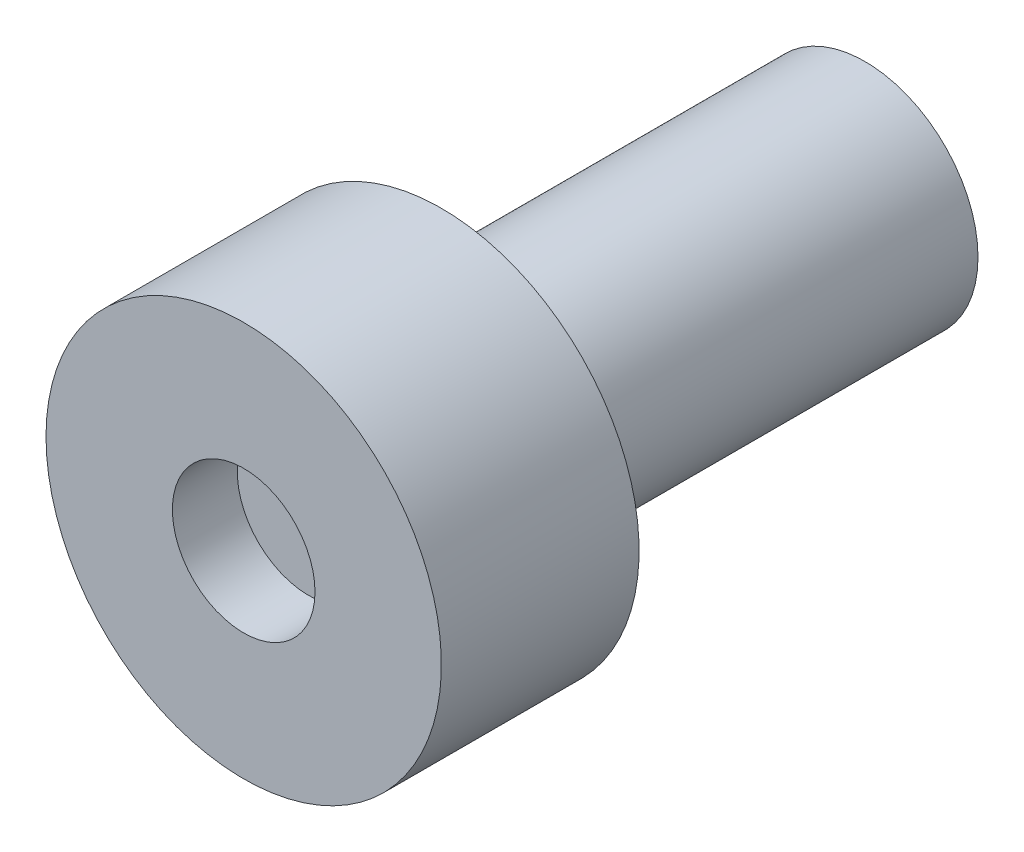
ISO-10303-21;
HEADER;
FILE_DESCRIPTION(('STEP AP214'),'2;1');
FILE_NAME('part.step','',(''),(''),'','','');
FILE_SCHEMA(('AUTOMOTIVE_DESIGN { 1 0 10303 214 1 1 1 1 }'));
ENDSEC;
DATA;
#1=APPLICATION_CONTEXT('core data for automotive mechanical design processes');
#2=APPLICATION_PROTOCOL_DEFINITION('international standard','automotive_design',2000,#1);
#3=PRODUCT_CONTEXT('',#1,'mechanical');
#4=PRODUCT('Part','Part','',(#3));
#5=PRODUCT_RELATED_PRODUCT_CATEGORY('part','',(#4));
#6=PRODUCT_DEFINITION_FORMATION('','',#4);
#7=PRODUCT_DEFINITION_CONTEXT('part definition',#1,'design');
#8=PRODUCT_DEFINITION('design','',#6,#7);
#9=PRODUCT_DEFINITION_SHAPE('','',#8);
#10=(LENGTH_UNIT() NAMED_UNIT(*) SI_UNIT(.MILLI.,.METRE.));
#11=(NAMED_UNIT(*) PLANE_ANGLE_UNIT() SI_UNIT($,.RADIAN.));
#12=(NAMED_UNIT(*) SI_UNIT($,.STERADIAN.) SOLID_ANGLE_UNIT());
#13=UNCERTAINTY_MEASURE_WITH_UNIT(LENGTH_MEASURE(1.E-05),#10,'distance_accuracy_value','');
#14=(GEOMETRIC_REPRESENTATION_CONTEXT(3) GLOBAL_UNCERTAINTY_ASSIGNED_CONTEXT((#13)) GLOBAL_UNIT_ASSIGNED_CONTEXT((#10,
#11,#12)) REPRESENTATION_CONTEXT('',''));
#15=CARTESIAN_POINT('',(0.,0.,0.));
#16=DIRECTION('',(0.,0.,1.));
#17=DIRECTION('',(1.,0.,0.));
#18=AXIS2_PLACEMENT_3D('',#15,#16,#17);
#19=CARTESIAN_POINT('',(0.,0.,15.));
#20=DIRECTION('',(0.,0.,-1.));
#21=DIRECTION('',(-1.,0.,0.));
#22=AXIS2_PLACEMENT_3D('',#19,#20,#21);
#23=CYLINDRICAL_SURFACE('',#22,4.);
#24=CARTESIAN_POINT('',(0.,0.,15.));
#25=DIRECTION('',(0.,0.,1.));
#26=DIRECTION('',(1.,0.,0.));
#27=AXIS2_PLACEMENT_3D('',#24,#25,#26);
#28=CIRCLE('',#27,4.);
#29=CARTESIAN_POINT('',(4.,0.,15.));
#30=VERTEX_POINT('',#29);
#31=EDGE_CURVE('E10',#30,#30,#28,.T.);
#32=ORIENTED_EDGE('',*,*,#31,.F.);
#33=EDGE_LOOP('',(#32));
#34=FACE_BOUND('',#33,.T.);
#35=CARTESIAN_POINT('',(0.,0.,0.));
#36=DIRECTION('',(0.,0.,1.));
#37=DIRECTION('',(1.,0.,0.));
#38=AXIS2_PLACEMENT_3D('',#35,#36,#37);
#39=CIRCLE('',#38,4.);
#40=CARTESIAN_POINT('',(4.,0.,0.));
#41=VERTEX_POINT('',#40);
#42=EDGE_CURVE('E36',#41,#41,#39,.T.);
#43=ORIENTED_EDGE('',*,*,#42,.T.);
#44=EDGE_LOOP('',(#43));
#45=FACE_BOUND('',#44,.T.);
#46=ADVANCED_FACE('F33',(#34,#45),#23,.T.);
#47=CARTESIAN_POINT('',(0.,0.,0.));
#48=DIRECTION('',(0.,0.,1.));
#49=DIRECTION('',(1.,0.,0.));
#50=AXIS2_PLACEMENT_3D('',#47,#48,#49);
#51=PLANE('',#50);
#52=ORIENTED_EDGE('',*,*,#42,.F.);
#53=EDGE_LOOP('',(#52));
#54=FACE_BOUND('',#53,.T.);
#55=ADVANCED_FACE('F75',(#54),#51,.F.);
#56=CARTESIAN_POINT('',(0.,0.,22.));
#57=DIRECTION('',(0.,0.,-1.));
#58=DIRECTION('',(-1.,0.,0.));
#59=AXIS2_PLACEMENT_3D('',#56,#57,#58);
#60=CYLINDRICAL_SURFACE('',#59,7.);
#61=CARTESIAN_POINT('',(0.,0.,22.));
#62=DIRECTION('',(0.,0.,1.));
#63=DIRECTION('',(1.,0.,0.));
#64=AXIS2_PLACEMENT_3D('',#61,#62,#63);
#65=CIRCLE('',#64,7.);
#66=CARTESIAN_POINT('',(-7.,0.,22.));
#67=VERTEX_POINT('',#66);
#68=EDGE_CURVE('E43',#67,#67,#65,.T.);
#69=CARTESIAN_POINT('',(0.,0.,15.));
#70=DIRECTION('',(0.,0.,1.));
#71=DIRECTION('',(1.,0.,0.));
#72=AXIS2_PLACEMENT_3D('',#69,#70,#71);
#73=CIRCLE('',#72,7.);
#74=CARTESIAN_POINT('',(-7.,0.,15.));
#75=VERTEX_POINT('',#74);
#76=EDGE_CURVE('E45',#75,#75,#73,.T.);
#77=CARTESIAN_POINT('',(-7.,0.,22.));
#78=CARTESIAN_POINT('',(-7.,0.,21.9270833333333));
#79=CARTESIAN_POINT('',(-7.,0.,21.8541666666667));
#80=CARTESIAN_POINT('',(-7.,0.,21.7083333333333));
#81=CARTESIAN_POINT('',(-7.,0.,21.6354166666667));
#82=CARTESIAN_POINT('',(-7.,0.,21.4895833333333));
#83=CARTESIAN_POINT('',(-7.,0.,21.4166666666667));
#84=CARTESIAN_POINT('',(-7.,0.,21.2708333333333));
#85=CARTESIAN_POINT('',(-7.,0.,21.1979166666667));
#86=CARTESIAN_POINT('',(-7.,0.,21.0520833333333));
#87=CARTESIAN_POINT('',(-7.,0.,20.9791666666667));
#88=CARTESIAN_POINT('',(-7.,0.,20.8333333333333));
#89=CARTESIAN_POINT('',(-7.,0.,20.7604166666667));
#90=CARTESIAN_POINT('',(-7.,0.,20.6145833333333));
#91=CARTESIAN_POINT('',(-7.,0.,20.5416666666667));
#92=CARTESIAN_POINT('',(-7.,0.,20.3958333333333));
#93=CARTESIAN_POINT('',(-7.,0.,20.3229166666667));
#94=CARTESIAN_POINT('',(-7.,0.,20.1770833333333));
#95=CARTESIAN_POINT('',(-7.,0.,20.1041666666667));
#96=CARTESIAN_POINT('',(-7.,0.,19.9583333333333));
#97=CARTESIAN_POINT('',(-7.,0.,19.8854166666667));
#98=CARTESIAN_POINT('',(-7.,0.,19.7395833333333));
#99=CARTESIAN_POINT('',(-7.,0.,19.6666666666667));
#100=CARTESIAN_POINT('',(-7.,0.,19.5208333333333));
#101=CARTESIAN_POINT('',(-7.,0.,19.4479166666667));
#102=CARTESIAN_POINT('',(-7.,0.,19.3020833333333));
#103=CARTESIAN_POINT('',(-7.,0.,19.2291666666667));
#104=CARTESIAN_POINT('',(-7.,0.,19.0833333333333));
#105=CARTESIAN_POINT('',(-7.,0.,19.0104166666667));
#106=CARTESIAN_POINT('',(-7.,0.,18.8645833333333));
#107=CARTESIAN_POINT('',(-7.,0.,18.7916666666667));
#108=CARTESIAN_POINT('',(-7.,0.,18.6458333333333));
#109=CARTESIAN_POINT('',(-7.,0.,18.5729166666667));
#110=CARTESIAN_POINT('',(-7.,0.,18.4270833333333));
#111=CARTESIAN_POINT('',(-7.,0.,18.3541666666667));
#112=CARTESIAN_POINT('',(-7.,0.,18.2083333333333));
#113=CARTESIAN_POINT('',(-7.,0.,18.1354166666667));
#114=CARTESIAN_POINT('',(-7.,0.,17.9895833333333));
#115=CARTESIAN_POINT('',(-7.,0.,17.9166666666667));
#116=CARTESIAN_POINT('',(-7.,0.,17.7708333333333));
#117=CARTESIAN_POINT('',(-7.,0.,17.6979166666667));
#118=CARTESIAN_POINT('',(-7.,0.,17.5520833333333));
#119=CARTESIAN_POINT('',(-7.,0.,17.4791666666667));
#120=CARTESIAN_POINT('',(-7.,0.,17.3333333333333));
#121=CARTESIAN_POINT('',(-7.,0.,17.2604166666667));
#122=CARTESIAN_POINT('',(-7.,0.,17.1145833333333));
#123=CARTESIAN_POINT('',(-7.,0.,17.0416666666667));
#124=CARTESIAN_POINT('',(-7.,0.,16.8958333333333));
#125=CARTESIAN_POINT('',(-7.,0.,16.8229166666667));
#126=CARTESIAN_POINT('',(-7.,0.,16.6770833333333));
#127=CARTESIAN_POINT('',(-7.,0.,16.6041666666667));
#128=CARTESIAN_POINT('',(-7.,0.,16.4583333333333));
#129=CARTESIAN_POINT('',(-7.,0.,16.3854166666667));
#130=CARTESIAN_POINT('',(-7.,0.,16.2395833333333));
#131=CARTESIAN_POINT('',(-7.,0.,16.1666666666667));
#132=CARTESIAN_POINT('',(-7.,0.,16.0208333333333));
#133=CARTESIAN_POINT('',(-7.,0.,15.9479166666667));
#134=CARTESIAN_POINT('',(-7.,0.,15.8020833333333));
#135=CARTESIAN_POINT('',(-7.,0.,15.7291666666667));
#136=CARTESIAN_POINT('',(-7.,0.,15.5833333333333));
#137=CARTESIAN_POINT('',(-7.,0.,15.5104166666667));
#138=CARTESIAN_POINT('',(-7.,0.,15.3645833333333));
#139=CARTESIAN_POINT('',(-7.,0.,15.2916666666667));
#140=CARTESIAN_POINT('',(-7.,0.,15.1458333333333));
#141=CARTESIAN_POINT('',(-7.,0.,15.0729166666667));
#142=CARTESIAN_POINT('',(-7.,0.,15.));
#143=B_SPLINE_CURVE_WITH_KNOTS('',3,(#77,#78,#79,#80,#81,#82,#83,#84,#85,#86,#87,#88,#89,#90,
#91,#92,#93,#94,#95,#96,#97,#98,#99,#100,#101,#102,#103,#104,#105,#106,#107,#108,#109,#110,#111,
#112,#113,#114,#115,#116,#117,#118,#119,#120,#121,#122,#123,#124,#125,#126,#127,#128,#129,#130,
#131,#132,#133,#134,#135,#136,#137,#138,#139,#140,#141,#142),.UNSPECIFIED.,.F.,.F.,(4,2,2,2,2,2,
2,2,2,2,2,2,2,2,2,2,2,2,2,2,2,2,2,2,2,2,2,2,2,2,2,2,4),(0.,0.21875,0.4375,0.656250000000001,
0.875000000000001,1.09375,1.3125,1.53125,1.75,1.96875,2.1875,2.40625,2.625,2.84375,3.0625,
3.28125,3.5,3.71875,3.9375,4.15625,4.375,4.59375,4.8125,5.03125,5.25,5.46875,5.6875,5.90625,
6.125,6.34375,6.5625,6.78125,7.),.UNSPECIFIED.);
#144=EDGE_CURVE('BSEAM69',#67,#75,#143,.T.);
#145=ORIENTED_EDGE('',*,*,#68,.F.);
#146=ORIENTED_EDGE('',*,*,#76,.T.);
#147=ORIENTED_EDGE('',*,*,#144,.T.);
#148=ORIENTED_EDGE('',*,*,#144,.F.);
#149=EDGE_LOOP('',(#145,#147,#146,#148));
#150=FACE_BOUND('',#149,.T.);
#151=ADVANCED_FACE('F69',(#150),#60,.T.);
#152=CARTESIAN_POINT('',(0.,0.,22.));
#153=DIRECTION('',(0.,0.,1.));
#154=DIRECTION('',(1.,0.,0.));
#155=AXIS2_PLACEMENT_3D('',#152,#153,#154);
#156=PLANE('',#155);
#157=CARTESIAN_POINT('',(0.,0.,22.));
#158=DIRECTION('',(0.,0.,1.));
#159=DIRECTION('',(1.,0.,0.));
#160=AXIS2_PLACEMENT_3D('',#157,#158,#159);
#161=CIRCLE('',#160,2.525);
#162=CARTESIAN_POINT('',(2.525,0.,22.));
#163=VERTEX_POINT('',#162);
#164=EDGE_CURVE('E51',#163,#163,#161,.T.);
#165=ORIENTED_EDGE('',*,*,#164,.F.);
#166=EDGE_LOOP('',(#165));
#167=FACE_BOUND('',#166,.T.);
#168=ORIENTED_EDGE('',*,*,#68,.T.);
#169=EDGE_LOOP('',(#168));
#170=FACE_BOUND('',#169,.T.);
#171=ADVANCED_FACE('F66',(#167,#170),#156,.T.);
#172=CARTESIAN_POINT('',(0.,0.,15.));
#173=DIRECTION('',(0.,0.,1.));
#174=DIRECTION('',(1.,0.,0.));
#175=AXIS2_PLACEMENT_3D('',#172,#173,#174);
#176=PLANE('',#175);
#177=ORIENTED_EDGE('',*,*,#31,.T.);
#178=EDGE_LOOP('',(#177));
#179=FACE_BOUND('',#178,.T.);
#180=ORIENTED_EDGE('',*,*,#76,.F.);
#181=EDGE_LOOP('',(#180));
#182=FACE_BOUND('',#181,.T.);
#183=ADVANCED_FACE('F62',(#179,#182),#176,.F.);
#184=CARTESIAN_POINT('',(0.,0.,19.7));
#185=DIRECTION('',(0.,0.,1.));
#186=DIRECTION('',(1.,0.,0.));
#187=AXIS2_PLACEMENT_3D('',#184,#185,#186);
#188=CYLINDRICAL_SURFACE('',#187,2.525);
#189=CARTESIAN_POINT('',(0.,0.,19.7));
#190=DIRECTION('',(0.,0.,1.));
#191=DIRECTION('',(1.,0.,0.));
#192=AXIS2_PLACEMENT_3D('',#189,#190,#191);
#193=CIRCLE('',#192,2.525);
#194=CARTESIAN_POINT('',(2.525,0.,19.7));
#195=VERTEX_POINT('',#194);
#196=EDGE_CURVE('E48',#195,#195,#193,.T.);
#197=ORIENTED_EDGE('',*,*,#196,.F.);
#198=EDGE_LOOP('',(#197));
#199=FACE_BOUND('',#198,.T.);
#200=ORIENTED_EDGE('',*,*,#164,.T.);
#201=EDGE_LOOP('',(#200));
#202=FACE_BOUND('',#201,.T.);
#203=ADVANCED_FACE('F59',(#199,#202),#188,.F.);
#204=CARTESIAN_POINT('',(0.,0.,19.7));
#205=DIRECTION('',(0.,0.,1.));
#206=DIRECTION('',(1.,0.,0.));
#207=AXIS2_PLACEMENT_3D('',#204,#205,#206);
#208=PLANE('',#207);
#209=ORIENTED_EDGE('',*,*,#196,.T.);
#210=EDGE_LOOP('',(#209));
#211=FACE_BOUND('',#210,.T.);
#212=ADVANCED_FACE('F57',(#211),#208,.T.);
#213=CLOSED_SHELL('',(#46,#55,#151,#171,#183,#203,#212));
#214=MANIFOLD_SOLID_BREP('B2',#213);
#215=ADVANCED_BREP_SHAPE_REPRESENTATION('',(#18,#214),#14);
#216=SHAPE_DEFINITION_REPRESENTATION(#9,#215);
ENDSEC;
END-ISO-10303-21;
